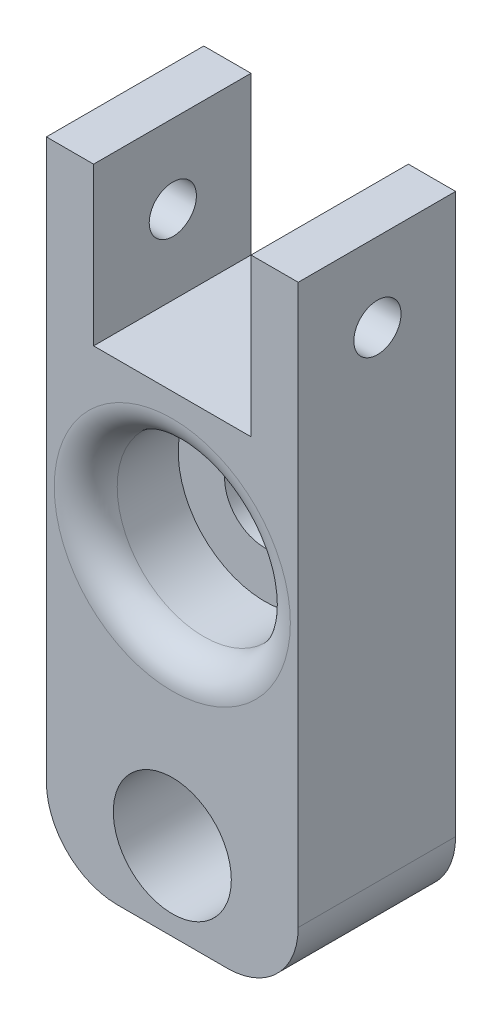
ISO-10303-21;
HEADER;
FILE_DESCRIPTION(('STEP AP214'),'2;1');
FILE_NAME('part.step','',(''),(''),'','','');
FILE_SCHEMA(('AUTOMOTIVE_DESIGN { 1 0 10303 214 1 1 1 1 }'));
ENDSEC;
DATA;
#1=APPLICATION_CONTEXT('core data for automotive mechanical design processes');
#2=APPLICATION_PROTOCOL_DEFINITION('international standard','automotive_design',2000,#1);
#3=PRODUCT_CONTEXT('',#1,'mechanical');
#4=PRODUCT('Part','Part','',(#3));
#5=PRODUCT_RELATED_PRODUCT_CATEGORY('part','',(#4));
#6=PRODUCT_DEFINITION_FORMATION('','',#4);
#7=PRODUCT_DEFINITION_CONTEXT('part definition',#1,'design');
#8=PRODUCT_DEFINITION('design','',#6,#7);
#9=PRODUCT_DEFINITION_SHAPE('','',#8);
#10=(LENGTH_UNIT() NAMED_UNIT(*) SI_UNIT(.MILLI.,.METRE.));
#11=(NAMED_UNIT(*) PLANE_ANGLE_UNIT() SI_UNIT($,.RADIAN.));
#12=(NAMED_UNIT(*) SI_UNIT($,.STERADIAN.) SOLID_ANGLE_UNIT());
#13=UNCERTAINTY_MEASURE_WITH_UNIT(LENGTH_MEASURE(1.E-05),#10,'distance_accuracy_value','');
#14=(GEOMETRIC_REPRESENTATION_CONTEXT(3) GLOBAL_UNCERTAINTY_ASSIGNED_CONTEXT((#13)) GLOBAL_UNIT_ASSIGNED_CONTEXT((#10,
#11,#12)) REPRESENTATION_CONTEXT('',''));
#15=CARTESIAN_POINT('',(0.,0.,0.));
#16=DIRECTION('',(0.,0.,1.));
#17=DIRECTION('',(1.,0.,0.));
#18=AXIS2_PLACEMENT_3D('',#15,#16,#17);
#19=CARTESIAN_POINT('',(-16.,-340.,-20.));
#20=DIRECTION('',(0.,1.,0.));
#21=DIRECTION('',(0.,0.,1.));
#22=AXIS2_PLACEMENT_3D('',#19,#20,#21);
#23=PLANE('',#22);
#24=DIRECTION('',(-1.,0.,0.));
#25=VECTOR('',#24,1.);
#26=CARTESIAN_POINT('',(-16.,-340.,-20.));
#27=LINE('',#26,#25);
#28=CARTESIAN_POINT('',(10.,-340.,-20.));
#29=VERTEX_POINT('',#28);
#30=CARTESIAN_POINT('',(-10.,-340.,-20.));
#31=VERTEX_POINT('',#30);
#32=EDGE_CURVE('E137',#29,#31,#27,.T.);
#33=ORIENTED_EDGE('',*,*,#32,.T.);
#34=DIRECTION('',(0.,0.,-1.));
#35=VECTOR('',#34,1.);
#36=CARTESIAN_POINT('',(-10.,-340.,-20.));
#37=LINE('',#36,#35);
#38=CARTESIAN_POINT('',(-10.,-340.,0.));
#39=VERTEX_POINT('',#38);
#40=EDGE_CURVE('E120',#39,#31,#37,.T.);
#41=ORIENTED_EDGE('',*,*,#40,.F.);
#42=DIRECTION('',(-1.,0.,0.));
#43=VECTOR('',#42,1.);
#44=CARTESIAN_POINT('',(-16.,-340.,0.));
#45=LINE('',#44,#43);
#46=CARTESIAN_POINT('',(10.,-340.,0.));
#47=VERTEX_POINT('',#46);
#48=EDGE_CURVE('E161',#47,#39,#45,.T.);
#49=ORIENTED_EDGE('',*,*,#48,.F.);
#50=DIRECTION('',(0.,0.,1.));
#51=VECTOR('',#50,1.);
#52=CARTESIAN_POINT('',(10.,-340.,-20.));
#53=LINE('',#52,#51);
#54=EDGE_CURVE('E131',#29,#47,#53,.T.);
#55=ORIENTED_EDGE('',*,*,#54,.F.);
#56=EDGE_LOOP('',(#33,#41,#49,#55));
#57=FACE_BOUND('',#56,.T.);
#58=ADVANCED_FACE('F41',(#57),#23,.T.);
#59=CARTESIAN_POINT('',(-1.11022302462516E-13,-358.,-20.));
#60=DIRECTION('',(0.,0.,1.));
#61=DIRECTION('',(1.,0.,0.));
#62=AXIS2_PLACEMENT_3D('',#59,#60,#61);
#63=CYLINDRICAL_SURFACE('',#62,5.09999999999999);
#64=CARTESIAN_POINT('',(-1.11022302462516E-13,-358.,-20.));
#65=DIRECTION('',(0.,0.,1.));
#66=DIRECTION('',(1.,0.,0.));
#67=AXIS2_PLACEMENT_3D('',#64,#65,#66);
#68=CIRCLE('',#67,5.09999999999999);
#69=CARTESIAN_POINT('',(5.09999999999988,-358.,-20.));
#70=VERTEX_POINT('',#69);
#71=EDGE_CURVE('E167',#70,#70,#68,.T.);
#72=ORIENTED_EDGE('',*,*,#71,.F.);
#73=EDGE_LOOP('',(#72));
#74=FACE_BOUND('',#73,.T.);
#75=CARTESIAN_POINT('',(-1.11022302462516E-13,-358.,-11.75));
#76=DIRECTION('',(0.,0.,1.));
#77=DIRECTION('',(1.,0.,0.));
#78=AXIS2_PLACEMENT_3D('',#75,#76,#77);
#79=CIRCLE('',#78,5.09999999999999);
#80=CARTESIAN_POINT('',(5.09999999999988,-358.,-11.75));
#81=VERTEX_POINT('',#80);
#82=EDGE_CURVE('E164',#81,#81,#79,.F.);
#83=ORIENTED_EDGE('',*,*,#82,.F.);
#84=EDGE_LOOP('',(#83));
#85=FACE_BOUND('',#84,.T.);
#86=ADVANCED_FACE('F203',(#74,#85),#63,.F.);
#87=CARTESIAN_POINT('',(-16.,-400.000000000001,-20.));
#88=DIRECTION('',(-1.,0.,0.));
#89=DIRECTION('',(0.,0.,1.));
#90=AXIS2_PLACEMENT_3D('',#87,#88,#89);
#91=PLANE('',#90);
#92=CARTESIAN_POINT('',(-16.,-330.,-10.0657650893662));
#93=DIRECTION('',(-1.,0.,0.));
#94=DIRECTION('',(0.,0.,1.));
#95=AXIS2_PLACEMENT_3D('',#92,#93,#94);
#96=CIRCLE('',#95,3.);
#97=CARTESIAN_POINT('',(-16.,-330.,-7.06576508936621));
#98=VERTEX_POINT('',#97);
#99=EDGE_CURVE('E281',#98,#98,#96,.T.);
#100=ORIENTED_EDGE('',*,*,#99,.F.);
#101=EDGE_LOOP('',(#100));
#102=FACE_BOUND('',#101,.T.);
#103=DIRECTION('',(0.,-1.,0.));
#104=VECTOR('',#103,1.);
#105=CARTESIAN_POINT('',(-16.,-400.000000000001,-20.));
#106=LINE('',#105,#104);
#107=CARTESIAN_POINT('',(-16.,-320.,-20.));
#108=VERTEX_POINT('',#107);
#109=CARTESIAN_POINT('',(-16.,-391.000000000001,-20.));
#110=VERTEX_POINT('',#109);
#111=EDGE_CURVE('E163',#108,#110,#106,.T.);
#112=ORIENTED_EDGE('',*,*,#111,.T.);
#113=DIRECTION('',(0.,0.,1.));
#114=VECTOR('',#113,1.);
#115=CARTESIAN_POINT('',(-16.,-391.000000000001,-20.));
#116=LINE('',#115,#114);
#117=CARTESIAN_POINT('',(-16.,-391.000000000001,0.));
#118=VERTEX_POINT('',#117);
#119=EDGE_CURVE('E184',#110,#118,#116,.T.);
#120=ORIENTED_EDGE('',*,*,#119,.T.);
#121=DIRECTION('',(0.,-1.,0.));
#122=VECTOR('',#121,1.);
#123=CARTESIAN_POINT('',(-16.,-400.000000000001,0.));
#124=LINE('',#123,#122);
#125=CARTESIAN_POINT('',(-16.,-320.,0.));
#126=VERTEX_POINT('',#125);
#127=EDGE_CURVE('E152',#126,#118,#124,.T.);
#128=ORIENTED_EDGE('',*,*,#127,.F.);
#129=DIRECTION('',(0.,0.,1.));
#130=VECTOR('',#129,1.);
#131=CARTESIAN_POINT('',(-16.,-320.,0.));
#132=LINE('',#131,#130);
#133=EDGE_CURVE('E132',#108,#126,#132,.T.);
#134=ORIENTED_EDGE('',*,*,#133,.F.);
#135=EDGE_LOOP('',(#112,#120,#128,#134));
#136=FACE_BOUND('',#135,.T.);
#137=ADVANCED_FACE('F210',(#102,#136),#91,.T.);
#138=CARTESIAN_POINT('',(16.,-340.,-20.));
#139=DIRECTION('',(1.,0.,0.));
#140=DIRECTION('',(0.,1.,0.));
#141=AXIS2_PLACEMENT_3D('',#138,#139,#140);
#142=PLANE('',#141);
#143=CARTESIAN_POINT('',(16.,-330.,-10.0657650893662));
#144=DIRECTION('',(-1.,0.,0.));
#145=DIRECTION('',(0.,0.,1.));
#146=AXIS2_PLACEMENT_3D('',#143,#144,#145);
#147=CIRCLE('',#146,3.);
#148=CARTESIAN_POINT('',(16.,-330.,-7.06576508936621));
#149=VERTEX_POINT('',#148);
#150=EDGE_CURVE('E172',#149,#149,#147,.T.);
#151=ORIENTED_EDGE('',*,*,#150,.T.);
#152=EDGE_LOOP('',(#151));
#153=FACE_BOUND('',#152,.T.);
#154=DIRECTION('',(0.,1.,0.));
#155=VECTOR('',#154,1.);
#156=CARTESIAN_POINT('',(16.,-340.,0.));
#157=LINE('',#156,#155);
#158=CARTESIAN_POINT('',(16.,-391.000000000001,0.));
#159=VERTEX_POINT('',#158);
#160=CARTESIAN_POINT('',(16.,-320.,0.));
#161=VERTEX_POINT('',#160);
#162=EDGE_CURVE('E159',#159,#161,#157,.T.);
#163=ORIENTED_EDGE('',*,*,#162,.F.);
#164=DIRECTION('',(0.,0.,1.));
#165=VECTOR('',#164,1.);
#166=CARTESIAN_POINT('',(16.,-391.000000000001,-20.));
#167=LINE('',#166,#165);
#168=CARTESIAN_POINT('',(16.,-391.000000000001,-20.));
#169=VERTEX_POINT('',#168);
#170=EDGE_CURVE('E64',#159,#169,#167,.F.);
#171=ORIENTED_EDGE('',*,*,#170,.T.);
#172=DIRECTION('',(0.,1.,0.));
#173=VECTOR('',#172,1.);
#174=CARTESIAN_POINT('',(16.,-340.,-20.));
#175=LINE('',#174,#173);
#176=CARTESIAN_POINT('',(16.,-320.,-20.));
#177=VERTEX_POINT('',#176);
#178=EDGE_CURVE('E144',#169,#177,#175,.T.);
#179=ORIENTED_EDGE('',*,*,#178,.T.);
#180=DIRECTION('',(0.,0.,-1.));
#181=VECTOR('',#180,1.);
#182=CARTESIAN_POINT('',(16.,-320.,0.));
#183=LINE('',#182,#181);
#184=EDGE_CURVE('E262',#161,#177,#183,.T.);
#185=ORIENTED_EDGE('',*,*,#184,.F.);
#186=EDGE_LOOP('',(#163,#171,#179,#185));
#187=FACE_BOUND('',#186,.T.);
#188=ADVANCED_FACE('F217',(#153,#187),#142,.T.);
#189=CARTESIAN_POINT('',(16.,-400.000000000001,-20.));
#190=DIRECTION('',(0.,-1.,0.));
#191=DIRECTION('',(0.,0.,-1.));
#192=AXIS2_PLACEMENT_3D('',#189,#190,#191);
#193=PLANE('',#192);
#194=DIRECTION('',(1.,0.,0.));
#195=VECTOR('',#194,1.);
#196=CARTESIAN_POINT('',(16.,-400.000000000001,-20.));
#197=LINE('',#196,#195);
#198=CARTESIAN_POINT('',(-7.,-400.000000000001,-20.));
#199=VERTEX_POINT('',#198);
#200=CARTESIAN_POINT('',(7.00000000000001,-400.000000000001,-20.));
#201=VERTEX_POINT('',#200);
#202=EDGE_CURVE('E148',#199,#201,#197,.T.);
#203=ORIENTED_EDGE('',*,*,#202,.T.);
#204=DIRECTION('',(0.,0.,1.));
#205=VECTOR('',#204,1.);
#206=CARTESIAN_POINT('',(7.00000000000001,-400.000000000001,-20.));
#207=LINE('',#206,#205);
#208=CARTESIAN_POINT('',(7.00000000000001,-400.000000000001,0.));
#209=VERTEX_POINT('',#208);
#210=EDGE_CURVE('E146',#201,#209,#207,.T.);
#211=ORIENTED_EDGE('',*,*,#210,.T.);
#212=DIRECTION('',(1.,0.,0.));
#213=VECTOR('',#212,1.);
#214=CARTESIAN_POINT('',(16.,-400.000000000001,0.));
#215=LINE('',#214,#213);
#216=CARTESIAN_POINT('',(-7.,-400.000000000001,0.));
#217=VERTEX_POINT('',#216);
#218=EDGE_CURVE('E155',#217,#209,#215,.T.);
#219=ORIENTED_EDGE('',*,*,#218,.F.);
#220=DIRECTION('',(0.,0.,1.));
#221=VECTOR('',#220,1.);
#222=CARTESIAN_POINT('',(-7.,-400.000000000001,-20.));
#223=LINE('',#222,#221);
#224=EDGE_CURVE('E143',#217,#199,#223,.F.);
#225=ORIENTED_EDGE('',*,*,#224,.T.);
#226=EDGE_LOOP('',(#203,#211,#219,#225));
#227=FACE_BOUND('',#226,.T.);
#228=ADVANCED_FACE('F220',(#227),#193,.T.);
#229=CARTESIAN_POINT('',(0.,0.,-20.));
#230=DIRECTION('',(0.,0.,-1.));
#231=DIRECTION('',(-1.,0.,0.));
#232=AXIS2_PLACEMENT_3D('',#229,#230,#231);
#233=PLANE('',#232);
#234=CARTESIAN_POINT('',(-4.44089209850063E-13,-390.,-20.));
#235=DIRECTION('',(0.,0.,1.));
#236=DIRECTION('',(1.,0.,0.));
#237=AXIS2_PLACEMENT_3D('',#234,#235,#236);
#238=CIRCLE('',#237,7.50000000000001);
#239=CARTESIAN_POINT('',(7.49999999999956,-390.,-20.));
#240=VERTEX_POINT('',#239);
#241=EDGE_CURVE('E156',#240,#240,#238,.T.);
#242=ORIENTED_EDGE('',*,*,#241,.T.);
#243=EDGE_LOOP('',(#242));
#244=FACE_BOUND('',#243,.T.);
#245=ORIENTED_EDGE('',*,*,#71,.T.);
#246=EDGE_LOOP('',(#245));
#247=FACE_BOUND('',#246,.T.);
#248=ORIENTED_EDGE('',*,*,#178,.F.);
#249=CARTESIAN_POINT('',(7.00000000000001,-391.000000000001,-20.));
#250=DIRECTION('',(0.,0.,-1.));
#251=DIRECTION('',(-1.,0.,0.));
#252=AXIS2_PLACEMENT_3D('',#249,#250,#251);
#253=CIRCLE('',#252,9.);
#254=EDGE_CURVE('E182',#169,#201,#253,.T.);
#255=ORIENTED_EDGE('',*,*,#254,.T.);
#256=ORIENTED_EDGE('',*,*,#202,.F.);
#257=CARTESIAN_POINT('',(-7.,-391.000000000001,-20.));
#258=DIRECTION('',(0.,0.,-1.));
#259=DIRECTION('',(-1.,0.,0.));
#260=AXIS2_PLACEMENT_3D('',#257,#258,#259);
#261=CIRCLE('',#260,9.);
#262=EDGE_CURVE('E56',#199,#110,#261,.T.);
#263=ORIENTED_EDGE('',*,*,#262,.T.);
#264=ORIENTED_EDGE('',*,*,#111,.F.);
#265=DIRECTION('',(-1.,0.,0.));
#266=VECTOR('',#265,1.);
#267=CARTESIAN_POINT('',(-16.,-320.,-20.));
#268=LINE('',#267,#266);
#269=CARTESIAN_POINT('',(-10.,-320.,-20.));
#270=VERTEX_POINT('',#269);
#271=EDGE_CURVE('E140',#270,#108,#268,.T.);
#272=ORIENTED_EDGE('',*,*,#271,.F.);
#273=DIRECTION('',(0.,-1.,0.));
#274=VECTOR('',#273,1.);
#275=CARTESIAN_POINT('',(-10.,-320.,-20.));
#276=LINE('',#275,#274);
#277=EDGE_CURVE('E124',#270,#31,#276,.T.);
#278=ORIENTED_EDGE('',*,*,#277,.T.);
#279=ORIENTED_EDGE('',*,*,#32,.F.);
#280=DIRECTION('',(0.,-1.,0.));
#281=VECTOR('',#280,1.);
#282=CARTESIAN_POINT('',(10.,-320.,-20.));
#283=LINE('',#282,#281);
#284=CARTESIAN_POINT('',(10.,-320.,-20.));
#285=VERTEX_POINT('',#284);
#286=EDGE_CURVE('E255',#285,#29,#283,.T.);
#287=ORIENTED_EDGE('',*,*,#286,.F.);
#288=DIRECTION('',(-1.,0.,0.));
#289=VECTOR('',#288,1.);
#290=CARTESIAN_POINT('',(16.,-320.,-20.));
#291=LINE('',#290,#289);
#292=EDGE_CURVE('E267',#177,#285,#291,.T.);
#293=ORIENTED_EDGE('',*,*,#292,.F.);
#294=EDGE_LOOP('',(#248,#255,#256,#263,#264,#272,#278,#279,#287,#293));
#295=FACE_BOUND('',#294,.T.);
#296=ADVANCED_FACE('F135',(#244,#247,#295),#233,.T.);
#297=CARTESIAN_POINT('',(0.,0.,0.));
#298=DIRECTION('',(0.,0.,-1.));
#299=DIRECTION('',(-1.,0.,0.));
#300=AXIS2_PLACEMENT_3D('',#297,#298,#299);
#301=PLANE('',#300);
#302=CARTESIAN_POINT('',(-1.11022302462516E-13,-358.,0.));
#303=DIRECTION('',(0.,0.,-1.));
#304=DIRECTION('',(-1.,0.,0.));
#305=AXIS2_PLACEMENT_3D('',#302,#303,#304);
#306=CIRCLE('',#305,15.);
#307=CARTESIAN_POINT('',(-15.0000000000001,-358.,0.));
#308=VERTEX_POINT('',#307);
#309=EDGE_CURVE('E11',#308,#308,#306,.T.);
#310=ORIENTED_EDGE('',*,*,#309,.T.);
#311=EDGE_LOOP('',(#310));
#312=FACE_BOUND('',#311,.T.);
#313=CARTESIAN_POINT('',(-4.44089209850063E-13,-390.,0.));
#314=DIRECTION('',(0.,0.,1.));
#315=DIRECTION('',(1.,0.,0.));
#316=AXIS2_PLACEMENT_3D('',#313,#314,#315);
#317=CIRCLE('',#316,7.50000000000001);
#318=CARTESIAN_POINT('',(7.49999999999956,-390.,0.));
#319=VERTEX_POINT('',#318);
#320=EDGE_CURVE('E248',#319,#319,#317,.T.);
#321=ORIENTED_EDGE('',*,*,#320,.F.);
#322=EDGE_LOOP('',(#321));
#323=FACE_BOUND('',#322,.T.);
#324=ORIENTED_EDGE('',*,*,#218,.T.);
#325=CARTESIAN_POINT('',(7.00000000000001,-391.000000000001,0.));
#326=DIRECTION('',(0.,0.,-1.));
#327=DIRECTION('',(-1.,0.,0.));
#328=AXIS2_PLACEMENT_3D('',#325,#326,#327);
#329=CIRCLE('',#328,9.);
#330=EDGE_CURVE('E178',#209,#159,#329,.F.);
#331=ORIENTED_EDGE('',*,*,#330,.T.);
#332=ORIENTED_EDGE('',*,*,#162,.T.);
#333=DIRECTION('',(1.,0.,0.));
#334=VECTOR('',#333,1.);
#335=CARTESIAN_POINT('',(10.,-320.,0.));
#336=LINE('',#335,#334);
#337=CARTESIAN_POINT('',(10.,-320.,0.));
#338=VERTEX_POINT('',#337);
#339=EDGE_CURVE('E260',#338,#161,#336,.T.);
#340=ORIENTED_EDGE('',*,*,#339,.F.);
#341=DIRECTION('',(0.,-1.,0.));
#342=VECTOR('',#341,1.);
#343=CARTESIAN_POINT('',(10.,-320.,0.));
#344=LINE('',#343,#342);
#345=EDGE_CURVE('E257',#338,#47,#344,.T.);
#346=ORIENTED_EDGE('',*,*,#345,.T.);
#347=ORIENTED_EDGE('',*,*,#48,.T.);
#348=DIRECTION('',(0.,-1.,0.));
#349=VECTOR('',#348,1.);
#350=CARTESIAN_POINT('',(-10.,-320.,0.));
#351=LINE('',#350,#349);
#352=CARTESIAN_POINT('',(-10.,-320.,0.));
#353=VERTEX_POINT('',#352);
#354=EDGE_CURVE('E127',#353,#39,#351,.T.);
#355=ORIENTED_EDGE('',*,*,#354,.F.);
#356=DIRECTION('',(1.,0.,0.));
#357=VECTOR('',#356,1.);
#358=CARTESIAN_POINT('',(-10.,-320.,0.));
#359=LINE('',#358,#357);
#360=EDGE_CURVE('E273',#126,#353,#359,.T.);
#361=ORIENTED_EDGE('',*,*,#360,.F.);
#362=ORIENTED_EDGE('',*,*,#127,.T.);
#363=CARTESIAN_POINT('',(-7.,-391.000000000001,0.));
#364=DIRECTION('',(0.,0.,-1.));
#365=DIRECTION('',(-1.,0.,0.));
#366=AXIS2_PLACEMENT_3D('',#363,#364,#365);
#367=CIRCLE('',#366,9.);
#368=EDGE_CURVE('E176',#118,#217,#367,.F.);
#369=ORIENTED_EDGE('',*,*,#368,.T.);
#370=EDGE_LOOP('',(#324,#331,#332,#340,#346,#347,#355,#361,#362,#369));
#371=FACE_BOUND('',#370,.T.);
#372=ADVANCED_FACE('F215',(#312,#323,#371),#301,.F.);
#373=CARTESIAN_POINT('',(-4.44089209850063E-13,-390.,-20.));
#374=DIRECTION('',(0.,0.,1.));
#375=DIRECTION('',(1.,0.,0.));
#376=AXIS2_PLACEMENT_3D('',#373,#374,#375);
#377=CYLINDRICAL_SURFACE('',#376,7.50000000000001);
#378=ORIENTED_EDGE('',*,*,#241,.F.);
#379=EDGE_LOOP('',(#378));
#380=FACE_BOUND('',#379,.T.);
#381=ORIENTED_EDGE('',*,*,#320,.T.);
#382=EDGE_LOOP('',(#381));
#383=FACE_BOUND('',#382,.T.);
#384=ADVANCED_FACE('F312',(#380,#383),#377,.F.);
#385=CARTESIAN_POINT('',(-1.11022302462516E-13,-358.,-11.75));
#386=DIRECTION('',(0.,0.,1.));
#387=DIRECTION('',(1.,0.,0.));
#388=AXIS2_PLACEMENT_3D('',#385,#386,#387);
#389=PLANE('',#388);
#390=CARTESIAN_POINT('',(-1.11022302462516E-13,-358.,-11.75));
#391=DIRECTION('',(0.,0.,1.));
#392=DIRECTION('',(1.,0.,0.));
#393=AXIS2_PLACEMENT_3D('',#390,#391,#392);
#394=CIRCLE('',#393,11.);
#395=CARTESIAN_POINT('',(10.9999999999999,-358.,-11.75));
#396=VERTEX_POINT('',#395);
#397=EDGE_CURVE('E168',#396,#396,#394,.T.);
#398=ORIENTED_EDGE('',*,*,#397,.T.);
#399=EDGE_LOOP('',(#398));
#400=FACE_BOUND('',#399,.T.);
#401=ORIENTED_EDGE('',*,*,#82,.T.);
#402=EDGE_LOOP('',(#401));
#403=FACE_BOUND('',#402,.T.);
#404=ADVANCED_FACE('F310',(#400,#403),#389,.T.);
#405=CARTESIAN_POINT('',(-1.11022302462516E-13,-358.,-11.75));
#406=DIRECTION('',(0.,0.,1.));
#407=DIRECTION('',(1.,0.,0.));
#408=AXIS2_PLACEMENT_3D('',#405,#406,#407);
#409=CYLINDRICAL_SURFACE('',#408,11.);
#410=CARTESIAN_POINT('',(-1.11022302462516E-13,-358.,-4.));
#411=DIRECTION('',(0.,0.,-1.));
#412=DIRECTION('',(-1.,0.,0.));
#413=AXIS2_PLACEMENT_3D('',#410,#411,#412);
#414=CIRCLE('',#413,11.);
#415=CARTESIAN_POINT('',(-11.0000000000001,-358.,-4.));
#416=VERTEX_POINT('',#415);
#417=EDGE_CURVE('E49',#416,#416,#414,.F.);
#418=ORIENTED_EDGE('',*,*,#417,.T.);
#419=EDGE_LOOP('',(#418));
#420=FACE_BOUND('',#419,.T.);
#421=ORIENTED_EDGE('',*,*,#397,.F.);
#422=EDGE_LOOP('',(#421));
#423=FACE_BOUND('',#422,.T.);
#424=ADVANCED_FACE('F189',(#420,#423),#409,.F.);
#425=CARTESIAN_POINT('',(10.,-320.,-20.));
#426=DIRECTION('',(1.,0.,0.));
#427=DIRECTION('',(0.,0.,-1.));
#428=AXIS2_PLACEMENT_3D('',#425,#426,#427);
#429=PLANE('',#428);
#430=CARTESIAN_POINT('',(10.,-330.,-10.0657650893662));
#431=DIRECTION('',(1.,0.,0.));
#432=DIRECTION('',(0.,0.,-1.));
#433=AXIS2_PLACEMENT_3D('',#430,#431,#432);
#434=CIRCLE('',#433,3.);
#435=CARTESIAN_POINT('',(10.,-330.,-13.0657650893662));
#436=VERTEX_POINT('',#435);
#437=EDGE_CURVE('E171',#436,#436,#434,.T.);
#438=ORIENTED_EDGE('',*,*,#437,.T.);
#439=EDGE_LOOP('',(#438));
#440=FACE_BOUND('',#439,.T.);
#441=ORIENTED_EDGE('',*,*,#54,.T.);
#442=ORIENTED_EDGE('',*,*,#345,.F.);
#443=DIRECTION('',(0.,0.,1.));
#444=VECTOR('',#443,1.);
#445=CARTESIAN_POINT('',(10.,-320.,-20.));
#446=LINE('',#445,#444);
#447=EDGE_CURVE('E265',#285,#338,#446,.T.);
#448=ORIENTED_EDGE('',*,*,#447,.F.);
#449=ORIENTED_EDGE('',*,*,#286,.T.);
#450=EDGE_LOOP('',(#441,#442,#448,#449));
#451=FACE_BOUND('',#450,.T.);
#452=ADVANCED_FACE('F289',(#440,#451),#429,.F.);
#453=CARTESIAN_POINT('',(0.,-320.,0.));
#454=DIRECTION('',(0.,1.,0.));
#455=DIRECTION('',(0.,0.,1.));
#456=AXIS2_PLACEMENT_3D('',#453,#454,#455);
#457=PLANE('',#456);
#458=ORIENTED_EDGE('',*,*,#184,.T.);
#459=ORIENTED_EDGE('',*,*,#292,.T.);
#460=ORIENTED_EDGE('',*,*,#447,.T.);
#461=ORIENTED_EDGE('',*,*,#339,.T.);
#462=EDGE_LOOP('',(#458,#459,#460,#461));
#463=FACE_BOUND('',#462,.T.);
#464=ADVANCED_FACE('F292',(#463),#457,.T.);
#465=CARTESIAN_POINT('',(-10.,-320.,-20.));
#466=DIRECTION('',(-1.,0.,0.));
#467=DIRECTION('',(0.,0.,1.));
#468=AXIS2_PLACEMENT_3D('',#465,#466,#467);
#469=PLANE('',#468);
#470=CARTESIAN_POINT('',(-10.,-330.,-10.0657650893662));
#471=DIRECTION('',(-1.,0.,0.));
#472=DIRECTION('',(0.,0.,1.));
#473=AXIS2_PLACEMENT_3D('',#470,#471,#472);
#474=CIRCLE('',#473,3.);
#475=CARTESIAN_POINT('',(-10.,-330.,-7.06576508936621));
#476=VERTEX_POINT('',#475);
#477=EDGE_CURVE('E169',#476,#476,#474,.T.);
#478=ORIENTED_EDGE('',*,*,#477,.T.);
#479=EDGE_LOOP('',(#478));
#480=FACE_BOUND('',#479,.T.);
#481=ORIENTED_EDGE('',*,*,#40,.T.);
#482=ORIENTED_EDGE('',*,*,#277,.F.);
#483=DIRECTION('',(0.,0.,-1.));
#484=VECTOR('',#483,1.);
#485=CARTESIAN_POINT('',(-10.,-320.,-20.));
#486=LINE('',#485,#484);
#487=EDGE_CURVE('E275',#353,#270,#486,.T.);
#488=ORIENTED_EDGE('',*,*,#487,.F.);
#489=ORIENTED_EDGE('',*,*,#354,.T.);
#490=EDGE_LOOP('',(#481,#482,#488,#489));
#491=FACE_BOUND('',#490,.T.);
#492=ADVANCED_FACE('F122',(#480,#491),#469,.F.);
#493=CARTESIAN_POINT('',(0.,-320.,0.));
#494=DIRECTION('',(0.,-1.,0.));
#495=DIRECTION('',(0.,0.,-1.));
#496=AXIS2_PLACEMENT_3D('',#493,#494,#495);
#497=PLANE('',#496);
#498=ORIENTED_EDGE('',*,*,#133,.T.);
#499=ORIENTED_EDGE('',*,*,#360,.T.);
#500=ORIENTED_EDGE('',*,*,#487,.T.);
#501=ORIENTED_EDGE('',*,*,#271,.T.);
#502=EDGE_LOOP('',(#498,#499,#500,#501));
#503=FACE_BOUND('',#502,.T.);
#504=ADVANCED_FACE('F305',(#503),#497,.F.);
#505=CARTESIAN_POINT('',(16.,-330.,-10.0657650893662));
#506=DIRECTION('',(-1.,0.,0.));
#507=DIRECTION('',(0.,0.,1.));
#508=AXIS2_PLACEMENT_3D('',#505,#506,#507);
#509=CYLINDRICAL_SURFACE('',#508,3.);
#510=ORIENTED_EDGE('',*,*,#99,.T.);
#511=EDGE_LOOP('',(#510));
#512=FACE_BOUND('',#511,.T.);
#513=ORIENTED_EDGE('',*,*,#477,.F.);
#514=EDGE_LOOP('',(#513));
#515=FACE_BOUND('',#514,.T.);
#516=ADVANCED_FACE('F235',(#512,#515),#509,.F.);
#517=ORIENTED_EDGE('',*,*,#150,.F.);
#518=EDGE_LOOP('',(#517));
#519=FACE_BOUND('',#518,.T.);
#520=ORIENTED_EDGE('',*,*,#437,.F.);
#521=EDGE_LOOP('',(#520));
#522=FACE_BOUND('',#521,.T.);
#523=ADVANCED_FACE('F229',(#519,#522),#509,.F.);
#524=CARTESIAN_POINT('',(7.00000000000001,-391.000000000001,-20.));
#525=DIRECTION('',(0.,0.,1.));
#526=DIRECTION('',(1.,0.,0.));
#527=AXIS2_PLACEMENT_3D('',#524,#525,#526);
#528=CYLINDRICAL_SURFACE('',#527,9.);
#529=ORIENTED_EDGE('',*,*,#254,.F.);
#530=ORIENTED_EDGE('',*,*,#170,.F.);
#531=ORIENTED_EDGE('',*,*,#330,.F.);
#532=ORIENTED_EDGE('',*,*,#210,.F.);
#533=EDGE_LOOP('',(#529,#530,#531,#532));
#534=FACE_BOUND('',#533,.T.);
#535=ADVANCED_FACE('F199',(#534),#528,.T.);
#536=CARTESIAN_POINT('',(-7.,-391.000000000001,-20.));
#537=DIRECTION('',(0.,0.,1.));
#538=DIRECTION('',(1.,0.,0.));
#539=AXIS2_PLACEMENT_3D('',#536,#537,#538);
#540=CYLINDRICAL_SURFACE('',#539,9.);
#541=ORIENTED_EDGE('',*,*,#262,.F.);
#542=ORIENTED_EDGE('',*,*,#224,.F.);
#543=ORIENTED_EDGE('',*,*,#368,.F.);
#544=ORIENTED_EDGE('',*,*,#119,.F.);
#545=EDGE_LOOP('',(#541,#542,#543,#544));
#546=FACE_BOUND('',#545,.T.);
#547=ADVANCED_FACE('F193',(#546),#540,.T.);
#548=CARTESIAN_POINT('',(-1.11022302462516E-13,-358.,-4.));
#549=DIRECTION('',(0.,0.,-1.));
#550=DIRECTION('',(-1.,0.,0.));
#551=AXIS2_PLACEMENT_3D('',#548,#549,#550);
#552=TOROIDAL_SURFACE('',#551,15.,4.);
#553=ORIENTED_EDGE('',*,*,#309,.F.);
#554=EDGE_LOOP('',(#553));
#555=FACE_BOUND('',#554,.T.);
#556=ORIENTED_EDGE('',*,*,#417,.F.);
#557=EDGE_LOOP('',(#556));
#558=FACE_BOUND('',#557,.T.);
#559=ADVANCED_FACE('F43',(#555,#558),#552,.T.);
#560=CLOSED_SHELL('',(#58,#86,#137,#188,#228,#296,#372,#384,#404,#424,#452,#464,#492,#504,#516,
#523,#535,#547,#559));
#561=MANIFOLD_SOLID_BREP('B2',#560);
#562=ADVANCED_BREP_SHAPE_REPRESENTATION('',(#18,#561),#14);
#563=SHAPE_DEFINITION_REPRESENTATION(#9,#562);
ENDSEC;
END-ISO-10303-21;
